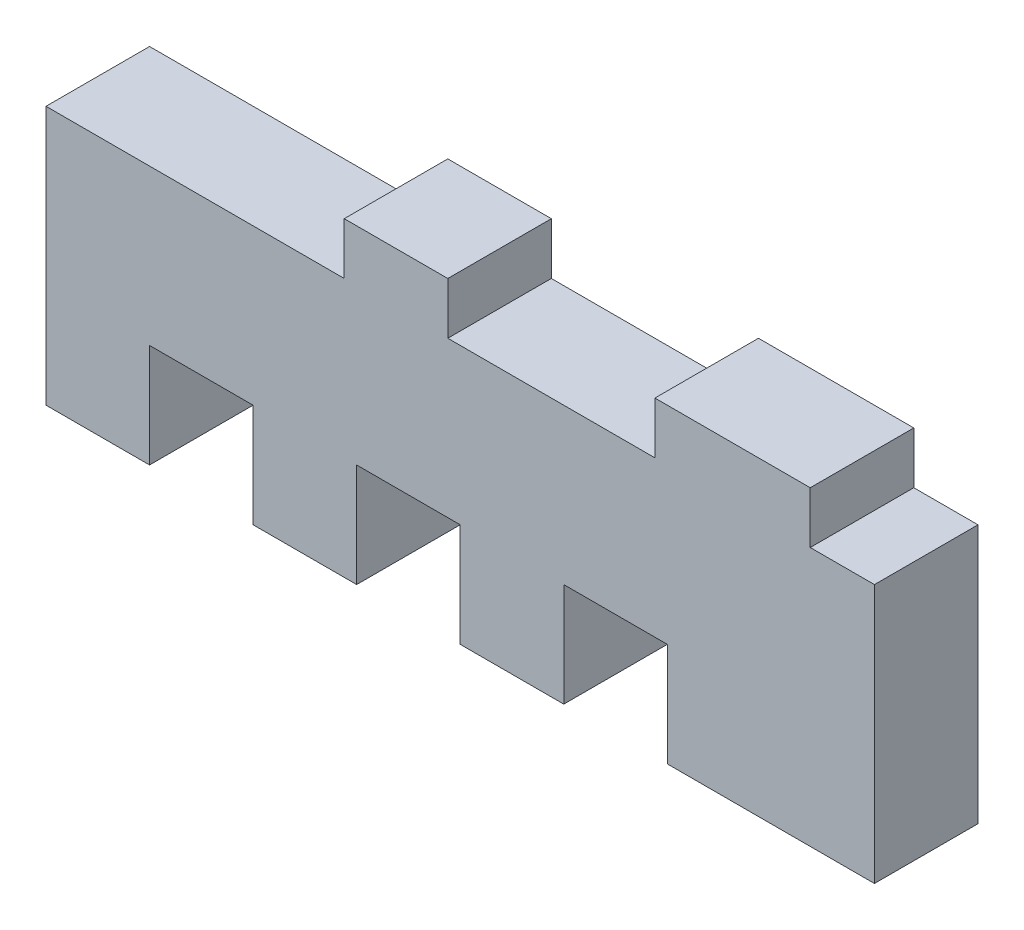
ISO-10303-21;
HEADER;
FILE_DESCRIPTION(('STEP AP214'),'2;1');
FILE_NAME('part.step','',(''),(''),'','','');
FILE_SCHEMA(('AUTOMOTIVE_DESIGN { 1 0 10303 214 1 1 1 1 }'));
ENDSEC;
DATA;
#1=APPLICATION_CONTEXT('core data for automotive mechanical design processes');
#2=APPLICATION_PROTOCOL_DEFINITION('international standard','automotive_design',2000,#1);
#3=PRODUCT_CONTEXT('',#1,'mechanical');
#4=PRODUCT('Part','Part','',(#3));
#5=PRODUCT_RELATED_PRODUCT_CATEGORY('part','',(#4));
#6=PRODUCT_DEFINITION_FORMATION('','',#4);
#7=PRODUCT_DEFINITION_CONTEXT('part definition',#1,'design');
#8=PRODUCT_DEFINITION('design','',#6,#7);
#9=PRODUCT_DEFINITION_SHAPE('','',#8);
#10=(LENGTH_UNIT() NAMED_UNIT(*) SI_UNIT(.MILLI.,.METRE.));
#11=(NAMED_UNIT(*) PLANE_ANGLE_UNIT() SI_UNIT($,.RADIAN.));
#12=(NAMED_UNIT(*) SI_UNIT($,.STERADIAN.) SOLID_ANGLE_UNIT());
#13=UNCERTAINTY_MEASURE_WITH_UNIT(LENGTH_MEASURE(1.E-05),#10,'distance_accuracy_value','');
#14=(GEOMETRIC_REPRESENTATION_CONTEXT(3) GLOBAL_UNCERTAINTY_ASSIGNED_CONTEXT((#13)) GLOBAL_UNIT_ASSIGNED_CONTEXT((#10,
#11,#12)) REPRESENTATION_CONTEXT('',''));
#15=CARTESIAN_POINT('',(0.,0.,0.));
#16=DIRECTION('',(0.,0.,1.));
#17=DIRECTION('',(1.,0.,0.));
#18=AXIS2_PLACEMENT_3D('',#15,#16,#17);
#19=CARTESIAN_POINT('',(0.,0.,12.7));
#20=DIRECTION('',(1.,0.,0.));
#21=DIRECTION('',(0.,1.,0.));
#22=AXIS2_PLACEMENT_3D('',#19,#20,#21);
#23=PLANE('',#22);
#24=DIRECTION('',(0.,-1.,0.));
#25=VECTOR('',#24,1.);
#26=CARTESIAN_POINT('',(0.,0.,0.));
#27=LINE('',#26,#25);
#28=CARTESIAN_POINT('',(0.,0.,0.));
#29=VERTEX_POINT('',#28);
#30=CARTESIAN_POINT('',(0.,-31.75,0.));
#31=VERTEX_POINT('',#30);
#32=EDGE_CURVE('E236',#29,#31,#27,.T.);
#33=ORIENTED_EDGE('',*,*,#32,.T.);
#34=DIRECTION('',(0.,0.,-1.));
#35=VECTOR('',#34,1.);
#36=CARTESIAN_POINT('',(0.,-31.75,12.7));
#37=LINE('',#36,#35);
#38=CARTESIAN_POINT('',(0.,-31.75,12.7));
#39=VERTEX_POINT('',#38);
#40=EDGE_CURVE('E11',#39,#31,#37,.T.);
#41=ORIENTED_EDGE('',*,*,#40,.F.);
#42=DIRECTION('',(0.,-1.,0.));
#43=VECTOR('',#42,1.);
#44=CARTESIAN_POINT('',(0.,0.,12.7));
#45=LINE('',#44,#43);
#46=CARTESIAN_POINT('',(0.,0.,12.7));
#47=VERTEX_POINT('',#46);
#48=EDGE_CURVE('E306',#47,#39,#45,.T.);
#49=ORIENTED_EDGE('',*,*,#48,.F.);
#50=DIRECTION('',(0.,0.,-1.));
#51=VECTOR('',#50,1.);
#52=CARTESIAN_POINT('',(0.,0.,12.7));
#53=LINE('',#52,#51);
#54=EDGE_CURVE('E232',#47,#29,#53,.T.);
#55=ORIENTED_EDGE('',*,*,#54,.T.);
#56=EDGE_LOOP('',(#33,#41,#49,#55));
#57=FACE_BOUND('',#56,.T.);
#58=ADVANCED_FACE('F39',(#57),#23,.F.);
#59=CARTESIAN_POINT('',(0.,-31.75,12.7));
#60=DIRECTION('',(0.,1.,0.));
#61=DIRECTION('',(0.,0.,1.));
#62=AXIS2_PLACEMENT_3D('',#59,#60,#61);
#63=PLANE('',#62);
#64=DIRECTION('',(1.,0.,0.));
#65=VECTOR('',#64,1.);
#66=CARTESIAN_POINT('',(0.,-31.75,0.));
#67=LINE('',#66,#65);
#68=CARTESIAN_POINT('',(12.7,-31.75,0.));
#69=VERTEX_POINT('',#68);
#70=EDGE_CURVE('E240',#31,#69,#67,.T.);
#71=ORIENTED_EDGE('',*,*,#70,.T.);
#72=DIRECTION('',(0.,0.,-1.));
#73=VECTOR('',#72,1.);
#74=CARTESIAN_POINT('',(12.7,-31.75,12.7));
#75=LINE('',#74,#73);
#76=CARTESIAN_POINT('',(12.7,-31.75,12.7));
#77=VERTEX_POINT('',#76);
#78=EDGE_CURVE('E48',#77,#69,#75,.T.);
#79=ORIENTED_EDGE('',*,*,#78,.F.);
#80=DIRECTION('',(1.,0.,0.));
#81=VECTOR('',#80,1.);
#82=CARTESIAN_POINT('',(0.,-31.75,12.7));
#83=LINE('',#82,#81);
#84=EDGE_CURVE('E147',#39,#77,#83,.T.);
#85=ORIENTED_EDGE('',*,*,#84,.F.);
#86=ORIENTED_EDGE('',*,*,#40,.T.);
#87=EDGE_LOOP('',(#71,#79,#85,#86));
#88=FACE_BOUND('',#87,.T.);
#89=ADVANCED_FACE('F484',(#88),#63,.F.);
#90=CARTESIAN_POINT('',(12.7,-31.75,12.7));
#91=DIRECTION('',(-1.,0.,0.));
#92=DIRECTION('',(0.,0.,1.));
#93=AXIS2_PLACEMENT_3D('',#90,#91,#92);
#94=PLANE('',#93);
#95=DIRECTION('',(0.,1.,0.));
#96=VECTOR('',#95,1.);
#97=CARTESIAN_POINT('',(12.7,-31.75,0.));
#98=LINE('',#97,#96);
#99=CARTESIAN_POINT('',(12.7,-19.05,0.));
#100=VERTEX_POINT('',#99);
#101=EDGE_CURVE('E243',#69,#100,#98,.T.);
#102=ORIENTED_EDGE('',*,*,#101,.T.);
#103=DIRECTION('',(0.,0.,-1.));
#104=VECTOR('',#103,1.);
#105=CARTESIAN_POINT('',(12.7,-19.05,12.7));
#106=LINE('',#105,#104);
#107=CARTESIAN_POINT('',(12.7,-19.05,12.7));
#108=VERTEX_POINT('',#107);
#109=EDGE_CURVE('E381',#108,#100,#106,.T.);
#110=ORIENTED_EDGE('',*,*,#109,.F.);
#111=DIRECTION('',(0.,1.,0.));
#112=VECTOR('',#111,1.);
#113=CARTESIAN_POINT('',(12.7,-31.75,12.7));
#114=LINE('',#113,#112);
#115=EDGE_CURVE('E391',#77,#108,#114,.T.);
#116=ORIENTED_EDGE('',*,*,#115,.F.);
#117=ORIENTED_EDGE('',*,*,#78,.T.);
#118=EDGE_LOOP('',(#102,#110,#116,#117));
#119=FACE_BOUND('',#118,.T.);
#120=ADVANCED_FACE('F389',(#119),#94,.F.);
#121=CARTESIAN_POINT('',(12.7,-19.05,12.7));
#122=DIRECTION('',(0.,1.,0.));
#123=DIRECTION('',(0.,0.,1.));
#124=AXIS2_PLACEMENT_3D('',#121,#122,#123);
#125=PLANE('',#124);
#126=DIRECTION('',(1.,0.,0.));
#127=VECTOR('',#126,1.);
#128=CARTESIAN_POINT('',(12.7,-19.05,0.));
#129=LINE('',#128,#127);
#130=CARTESIAN_POINT('',(25.4,-19.05,0.));
#131=VERTEX_POINT('',#130);
#132=EDGE_CURVE('E246',#100,#131,#129,.T.);
#133=ORIENTED_EDGE('',*,*,#132,.T.);
#134=DIRECTION('',(0.,0.,-1.));
#135=VECTOR('',#134,1.);
#136=CARTESIAN_POINT('',(25.4,-19.05,12.7));
#137=LINE('',#136,#135);
#138=CARTESIAN_POINT('',(25.4,-19.05,12.7));
#139=VERTEX_POINT('',#138);
#140=EDGE_CURVE('E377',#139,#131,#137,.T.);
#141=ORIENTED_EDGE('',*,*,#140,.F.);
#142=DIRECTION('',(1.,0.,0.));
#143=VECTOR('',#142,1.);
#144=CARTESIAN_POINT('',(12.7,-19.05,12.7));
#145=LINE('',#144,#143);
#146=EDGE_CURVE('E410',#108,#139,#145,.T.);
#147=ORIENTED_EDGE('',*,*,#146,.F.);
#148=ORIENTED_EDGE('',*,*,#109,.T.);
#149=EDGE_LOOP('',(#133,#141,#147,#148));
#150=FACE_BOUND('',#149,.T.);
#151=ADVANCED_FACE('F400',(#150),#125,.F.);
#152=CARTESIAN_POINT('',(25.4,-19.05,12.7));
#153=DIRECTION('',(1.,0.,0.));
#154=DIRECTION('',(0.,0.,-1.));
#155=AXIS2_PLACEMENT_3D('',#152,#153,#154);
#156=PLANE('',#155);
#157=DIRECTION('',(0.,-1.,0.));
#158=VECTOR('',#157,1.);
#159=CARTESIAN_POINT('',(25.4,-19.05,0.));
#160=LINE('',#159,#158);
#161=CARTESIAN_POINT('',(25.4,-31.75,0.));
#162=VERTEX_POINT('',#161);
#163=EDGE_CURVE('E249',#131,#162,#160,.T.);
#164=ORIENTED_EDGE('',*,*,#163,.T.);
#165=DIRECTION('',(0.,0.,-1.));
#166=VECTOR('',#165,1.);
#167=CARTESIAN_POINT('',(25.4,-31.75,12.7));
#168=LINE('',#167,#166);
#169=CARTESIAN_POINT('',(25.4,-31.75,12.7));
#170=VERTEX_POINT('',#169);
#171=EDGE_CURVE('E373',#170,#162,#168,.T.);
#172=ORIENTED_EDGE('',*,*,#171,.F.);
#173=DIRECTION('',(0.,-1.,0.));
#174=VECTOR('',#173,1.);
#175=CARTESIAN_POINT('',(25.4,-19.05,12.7));
#176=LINE('',#175,#174);
#177=EDGE_CURVE('E406',#139,#170,#176,.T.);
#178=ORIENTED_EDGE('',*,*,#177,.F.);
#179=ORIENTED_EDGE('',*,*,#140,.T.);
#180=EDGE_LOOP('',(#164,#172,#178,#179));
#181=FACE_BOUND('',#180,.T.);
#182=ADVANCED_FACE('F404',(#181),#156,.F.);
#183=CARTESIAN_POINT('',(25.4,-31.75,12.7));
#184=DIRECTION('',(0.,1.,0.));
#185=DIRECTION('',(0.,0.,1.));
#186=AXIS2_PLACEMENT_3D('',#183,#184,#185);
#187=PLANE('',#186);
#188=DIRECTION('',(1.,0.,0.));
#189=VECTOR('',#188,1.);
#190=CARTESIAN_POINT('',(25.4,-31.75,0.));
#191=LINE('',#190,#189);
#192=CARTESIAN_POINT('',(38.1,-31.75,0.));
#193=VERTEX_POINT('',#192);
#194=EDGE_CURVE('E252',#162,#193,#191,.T.);
#195=ORIENTED_EDGE('',*,*,#194,.T.);
#196=DIRECTION('',(0.,0.,-1.));
#197=VECTOR('',#196,1.);
#198=CARTESIAN_POINT('',(38.1,-31.75,12.7));
#199=LINE('',#198,#197);
#200=CARTESIAN_POINT('',(38.1,-31.75,12.7));
#201=VERTEX_POINT('',#200);
#202=EDGE_CURVE('E369',#201,#193,#199,.T.);
#203=ORIENTED_EDGE('',*,*,#202,.F.);
#204=DIRECTION('',(1.,0.,0.));
#205=VECTOR('',#204,1.);
#206=CARTESIAN_POINT('',(25.4,-31.75,12.7));
#207=LINE('',#206,#205);
#208=EDGE_CURVE('E409',#170,#201,#207,.T.);
#209=ORIENTED_EDGE('',*,*,#208,.F.);
#210=ORIENTED_EDGE('',*,*,#171,.T.);
#211=EDGE_LOOP('',(#195,#203,#209,#210));
#212=FACE_BOUND('',#211,.T.);
#213=ADVANCED_FACE('F497',(#212),#187,.F.);
#214=CARTESIAN_POINT('',(38.1,-31.75,12.7));
#215=DIRECTION('',(-1.,0.,0.));
#216=DIRECTION('',(0.,0.,1.));
#217=AXIS2_PLACEMENT_3D('',#214,#215,#216);
#218=PLANE('',#217);
#219=DIRECTION('',(0.,1.,0.));
#220=VECTOR('',#219,1.);
#221=CARTESIAN_POINT('',(38.1,-31.75,0.));
#222=LINE('',#221,#220);
#223=CARTESIAN_POINT('',(38.1,-19.05,0.));
#224=VERTEX_POINT('',#223);
#225=EDGE_CURVE('E255',#193,#224,#222,.T.);
#226=ORIENTED_EDGE('',*,*,#225,.T.);
#227=DIRECTION('',(0.,0.,-1.));
#228=VECTOR('',#227,1.);
#229=CARTESIAN_POINT('',(38.1,-19.05,12.7));
#230=LINE('',#229,#228);
#231=CARTESIAN_POINT('',(38.1,-19.05,12.7));
#232=VERTEX_POINT('',#231);
#233=EDGE_CURVE('E365',#232,#224,#230,.T.);
#234=ORIENTED_EDGE('',*,*,#233,.F.);
#235=DIRECTION('',(0.,1.,0.));
#236=VECTOR('',#235,1.);
#237=CARTESIAN_POINT('',(38.1,-31.75,12.7));
#238=LINE('',#237,#236);
#239=EDGE_CURVE('E414',#201,#232,#238,.T.);
#240=ORIENTED_EDGE('',*,*,#239,.F.);
#241=ORIENTED_EDGE('',*,*,#202,.T.);
#242=EDGE_LOOP('',(#226,#234,#240,#241));
#243=FACE_BOUND('',#242,.T.);
#244=ADVANCED_FACE('F500',(#243),#218,.F.);
#245=CARTESIAN_POINT('',(38.1,-19.05,12.7));
#246=DIRECTION('',(0.,1.,0.));
#247=DIRECTION('',(0.,0.,1.));
#248=AXIS2_PLACEMENT_3D('',#245,#246,#247);
#249=PLANE('',#248);
#250=DIRECTION('',(1.,0.,0.));
#251=VECTOR('',#250,1.);
#252=CARTESIAN_POINT('',(38.1,-19.05,0.));
#253=LINE('',#252,#251);
#254=CARTESIAN_POINT('',(50.8,-19.05,0.));
#255=VERTEX_POINT('',#254);
#256=EDGE_CURVE('E258',#224,#255,#253,.T.);
#257=ORIENTED_EDGE('',*,*,#256,.T.);
#258=DIRECTION('',(0.,0.,-1.));
#259=VECTOR('',#258,1.);
#260=CARTESIAN_POINT('',(50.8,-19.05,12.7));
#261=LINE('',#260,#259);
#262=CARTESIAN_POINT('',(50.8,-19.05,12.7));
#263=VERTEX_POINT('',#262);
#264=EDGE_CURVE('E361',#263,#255,#261,.T.);
#265=ORIENTED_EDGE('',*,*,#264,.F.);
#266=DIRECTION('',(1.,0.,0.));
#267=VECTOR('',#266,1.);
#268=CARTESIAN_POINT('',(38.1,-19.05,12.7));
#269=LINE('',#268,#267);
#270=EDGE_CURVE('E421',#232,#263,#269,.T.);
#271=ORIENTED_EDGE('',*,*,#270,.F.);
#272=ORIENTED_EDGE('',*,*,#233,.T.);
#273=EDGE_LOOP('',(#257,#265,#271,#272));
#274=FACE_BOUND('',#273,.T.);
#275=ADVANCED_FACE('F504',(#274),#249,.F.);
#276=CARTESIAN_POINT('',(50.8,-19.05,12.7));
#277=DIRECTION('',(1.,0.,0.));
#278=DIRECTION('',(0.,0.,-1.));
#279=AXIS2_PLACEMENT_3D('',#276,#277,#278);
#280=PLANE('',#279);
#281=DIRECTION('',(0.,-1.,0.));
#282=VECTOR('',#281,1.);
#283=CARTESIAN_POINT('',(50.8,-19.05,0.));
#284=LINE('',#283,#282);
#285=CARTESIAN_POINT('',(50.8,-31.75,0.));
#286=VERTEX_POINT('',#285);
#287=EDGE_CURVE('E261',#255,#286,#284,.T.);
#288=ORIENTED_EDGE('',*,*,#287,.T.);
#289=DIRECTION('',(0.,0.,-1.));
#290=VECTOR('',#289,1.);
#291=CARTESIAN_POINT('',(50.8,-31.75,12.7));
#292=LINE('',#291,#290);
#293=CARTESIAN_POINT('',(50.8,-31.75,12.7));
#294=VERTEX_POINT('',#293);
#295=EDGE_CURVE('E357',#294,#286,#292,.T.);
#296=ORIENTED_EDGE('',*,*,#295,.F.);
#297=DIRECTION('',(0.,-1.,0.));
#298=VECTOR('',#297,1.);
#299=CARTESIAN_POINT('',(50.8,-19.05,12.7));
#300=LINE('',#299,#298);
#301=EDGE_CURVE('E424',#263,#294,#300,.T.);
#302=ORIENTED_EDGE('',*,*,#301,.F.);
#303=ORIENTED_EDGE('',*,*,#264,.T.);
#304=EDGE_LOOP('',(#288,#296,#302,#303));
#305=FACE_BOUND('',#304,.T.);
#306=ADVANCED_FACE('F508',(#305),#280,.F.);
#307=CARTESIAN_POINT('',(50.8,-31.75,12.7));
#308=DIRECTION('',(0.,1.,0.));
#309=DIRECTION('',(0.,0.,1.));
#310=AXIS2_PLACEMENT_3D('',#307,#308,#309);
#311=PLANE('',#310);
#312=DIRECTION('',(1.,0.,0.));
#313=VECTOR('',#312,1.);
#314=CARTESIAN_POINT('',(50.8,-31.75,0.));
#315=LINE('',#314,#313);
#316=CARTESIAN_POINT('',(63.5,-31.75,0.));
#317=VERTEX_POINT('',#316);
#318=EDGE_CURVE('E264',#286,#317,#315,.T.);
#319=ORIENTED_EDGE('',*,*,#318,.T.);
#320=DIRECTION('',(0.,0.,-1.));
#321=VECTOR('',#320,1.);
#322=CARTESIAN_POINT('',(63.5,-31.75,12.7));
#323=LINE('',#322,#321);
#324=CARTESIAN_POINT('',(63.5,-31.75,12.7));
#325=VERTEX_POINT('',#324);
#326=EDGE_CURVE('E353',#325,#317,#323,.T.);
#327=ORIENTED_EDGE('',*,*,#326,.F.);
#328=DIRECTION('',(1.,0.,0.));
#329=VECTOR('',#328,1.);
#330=CARTESIAN_POINT('',(50.8,-31.75,12.7));
#331=LINE('',#330,#329);
#332=EDGE_CURVE('E427',#294,#325,#331,.T.);
#333=ORIENTED_EDGE('',*,*,#332,.F.);
#334=ORIENTED_EDGE('',*,*,#295,.T.);
#335=EDGE_LOOP('',(#319,#327,#333,#334));
#336=FACE_BOUND('',#335,.T.);
#337=ADVANCED_FACE('F512',(#336),#311,.F.);
#338=CARTESIAN_POINT('',(63.5,-31.75,12.7));
#339=DIRECTION('',(-1.,0.,0.));
#340=DIRECTION('',(0.,0.,1.));
#341=AXIS2_PLACEMENT_3D('',#338,#339,#340);
#342=PLANE('',#341);
#343=DIRECTION('',(0.,1.,0.));
#344=VECTOR('',#343,1.);
#345=CARTESIAN_POINT('',(63.5,-31.75,0.));
#346=LINE('',#345,#344);
#347=CARTESIAN_POINT('',(63.5,-19.05,0.));
#348=VERTEX_POINT('',#347);
#349=EDGE_CURVE('E267',#317,#348,#346,.T.);
#350=ORIENTED_EDGE('',*,*,#349,.T.);
#351=DIRECTION('',(0.,0.,-1.));
#352=VECTOR('',#351,1.);
#353=CARTESIAN_POINT('',(63.5,-19.05,12.7));
#354=LINE('',#353,#352);
#355=CARTESIAN_POINT('',(63.5,-19.05,12.7));
#356=VERTEX_POINT('',#355);
#357=EDGE_CURVE('E349',#356,#348,#354,.T.);
#358=ORIENTED_EDGE('',*,*,#357,.F.);
#359=DIRECTION('',(0.,1.,0.));
#360=VECTOR('',#359,1.);
#361=CARTESIAN_POINT('',(63.5,-31.75,12.7));
#362=LINE('',#361,#360);
#363=EDGE_CURVE('E430',#325,#356,#362,.T.);
#364=ORIENTED_EDGE('',*,*,#363,.F.);
#365=ORIENTED_EDGE('',*,*,#326,.T.);
#366=EDGE_LOOP('',(#350,#358,#364,#365));
#367=FACE_BOUND('',#366,.T.);
#368=ADVANCED_FACE('F516',(#367),#342,.F.);
#369=CARTESIAN_POINT('',(63.5,-19.05,12.7));
#370=DIRECTION('',(0.,1.,0.));
#371=DIRECTION('',(0.,0.,1.));
#372=AXIS2_PLACEMENT_3D('',#369,#370,#371);
#373=PLANE('',#372);
#374=DIRECTION('',(1.,0.,0.));
#375=VECTOR('',#374,1.);
#376=CARTESIAN_POINT('',(63.5,-19.05,0.));
#377=LINE('',#376,#375);
#378=CARTESIAN_POINT('',(76.2,-19.05,0.));
#379=VERTEX_POINT('',#378);
#380=EDGE_CURVE('E270',#348,#379,#377,.T.);
#381=ORIENTED_EDGE('',*,*,#380,.T.);
#382=DIRECTION('',(0.,0.,-1.));
#383=VECTOR('',#382,1.);
#384=CARTESIAN_POINT('',(76.2,-19.05,12.7));
#385=LINE('',#384,#383);
#386=CARTESIAN_POINT('',(76.2,-19.05,12.7));
#387=VERTEX_POINT('',#386);
#388=EDGE_CURVE('E345',#387,#379,#385,.T.);
#389=ORIENTED_EDGE('',*,*,#388,.F.);
#390=DIRECTION('',(1.,0.,0.));
#391=VECTOR('',#390,1.);
#392=CARTESIAN_POINT('',(63.5,-19.05,12.7));
#393=LINE('',#392,#391);
#394=EDGE_CURVE('E433',#356,#387,#393,.T.);
#395=ORIENTED_EDGE('',*,*,#394,.F.);
#396=ORIENTED_EDGE('',*,*,#357,.T.);
#397=EDGE_LOOP('',(#381,#389,#395,#396));
#398=FACE_BOUND('',#397,.T.);
#399=ADVANCED_FACE('F520',(#398),#373,.F.);
#400=CARTESIAN_POINT('',(76.2,-19.05,12.7));
#401=DIRECTION('',(1.,0.,0.));
#402=DIRECTION('',(0.,0.,-1.));
#403=AXIS2_PLACEMENT_3D('',#400,#401,#402);
#404=PLANE('',#403);
#405=DIRECTION('',(0.,-1.,0.));
#406=VECTOR('',#405,1.);
#407=CARTESIAN_POINT('',(76.2,-19.05,0.));
#408=LINE('',#407,#406);
#409=CARTESIAN_POINT('',(76.2,-31.75,0.));
#410=VERTEX_POINT('',#409);
#411=EDGE_CURVE('E273',#379,#410,#408,.T.);
#412=ORIENTED_EDGE('',*,*,#411,.T.);
#413=DIRECTION('',(0.,0.,-1.));
#414=VECTOR('',#413,1.);
#415=CARTESIAN_POINT('',(76.2,-31.75,12.7));
#416=LINE('',#415,#414);
#417=CARTESIAN_POINT('',(76.2,-31.75,12.7));
#418=VERTEX_POINT('',#417);
#419=EDGE_CURVE('E341',#418,#410,#416,.T.);
#420=ORIENTED_EDGE('',*,*,#419,.F.);
#421=DIRECTION('',(0.,-1.,0.));
#422=VECTOR('',#421,1.);
#423=CARTESIAN_POINT('',(76.2,-19.05,12.7));
#424=LINE('',#423,#422);
#425=EDGE_CURVE('E436',#387,#418,#424,.T.);
#426=ORIENTED_EDGE('',*,*,#425,.F.);
#427=ORIENTED_EDGE('',*,*,#388,.T.);
#428=EDGE_LOOP('',(#412,#420,#426,#427));
#429=FACE_BOUND('',#428,.T.);
#430=ADVANCED_FACE('F524',(#429),#404,.F.);
#431=CARTESIAN_POINT('',(76.2,-31.75,12.7));
#432=DIRECTION('',(0.,1.,0.));
#433=DIRECTION('',(0.,0.,1.));
#434=AXIS2_PLACEMENT_3D('',#431,#432,#433);
#435=PLANE('',#434);
#436=DIRECTION('',(1.,0.,0.));
#437=VECTOR('',#436,1.);
#438=CARTESIAN_POINT('',(76.2,-31.75,0.));
#439=LINE('',#438,#437);
#440=CARTESIAN_POINT('',(101.6,-31.75,0.));
#441=VERTEX_POINT('',#440);
#442=EDGE_CURVE('E276',#410,#441,#439,.T.);
#443=ORIENTED_EDGE('',*,*,#442,.T.);
#444=DIRECTION('',(0.,0.,-1.));
#445=VECTOR('',#444,1.);
#446=CARTESIAN_POINT('',(101.6,-31.75,12.7));
#447=LINE('',#446,#445);
#448=CARTESIAN_POINT('',(101.6,-31.75,12.7));
#449=VERTEX_POINT('',#448);
#450=EDGE_CURVE('E337',#449,#441,#447,.T.);
#451=ORIENTED_EDGE('',*,*,#450,.F.);
#452=DIRECTION('',(1.,0.,0.));
#453=VECTOR('',#452,1.);
#454=CARTESIAN_POINT('',(76.2,-31.75,12.7));
#455=LINE('',#454,#453);
#456=EDGE_CURVE('E439',#418,#449,#455,.T.);
#457=ORIENTED_EDGE('',*,*,#456,.F.);
#458=ORIENTED_EDGE('',*,*,#419,.T.);
#459=EDGE_LOOP('',(#443,#451,#457,#458));
#460=FACE_BOUND('',#459,.T.);
#461=ADVANCED_FACE('F528',(#460),#435,.F.);
#462=CARTESIAN_POINT('',(101.6,0.,12.7));
#463=DIRECTION('',(-1.,0.,0.));
#464=DIRECTION('',(0.,0.,1.));
#465=AXIS2_PLACEMENT_3D('',#462,#463,#464);
#466=PLANE('',#465);
#467=DIRECTION('',(0.,1.,0.));
#468=VECTOR('',#467,1.);
#469=CARTESIAN_POINT('',(101.6,0.,0.));
#470=LINE('',#469,#468);
#471=CARTESIAN_POINT('',(101.6,0.,0.));
#472=VERTEX_POINT('',#471);
#473=EDGE_CURVE('E279',#441,#472,#470,.T.);
#474=ORIENTED_EDGE('',*,*,#473,.T.);
#475=DIRECTION('',(0.,0.,-1.));
#476=VECTOR('',#475,1.);
#477=CARTESIAN_POINT('',(101.6,0.,12.7));
#478=LINE('',#477,#476);
#479=CARTESIAN_POINT('',(101.6,0.,12.7));
#480=VERTEX_POINT('',#479);
#481=EDGE_CURVE('E333',#480,#472,#478,.T.);
#482=ORIENTED_EDGE('',*,*,#481,.F.);
#483=DIRECTION('',(0.,1.,0.));
#484=VECTOR('',#483,1.);
#485=CARTESIAN_POINT('',(101.6,0.,12.7));
#486=LINE('',#485,#484);
#487=EDGE_CURVE('E442',#449,#480,#486,.T.);
#488=ORIENTED_EDGE('',*,*,#487,.F.);
#489=ORIENTED_EDGE('',*,*,#450,.T.);
#490=EDGE_LOOP('',(#474,#482,#488,#489));
#491=FACE_BOUND('',#490,.T.);
#492=ADVANCED_FACE('F532',(#491),#466,.F.);
#493=CARTESIAN_POINT('',(93.726,0.,12.7));
#494=DIRECTION('',(0.,-1.,0.));
#495=DIRECTION('',(0.,0.,-1.));
#496=AXIS2_PLACEMENT_3D('',#493,#494,#495);
#497=PLANE('',#496);
#498=DIRECTION('',(-1.,0.,0.));
#499=VECTOR('',#498,1.);
#500=CARTESIAN_POINT('',(93.726,0.,0.));
#501=LINE('',#500,#499);
#502=CARTESIAN_POINT('',(93.726,0.,0.));
#503=VERTEX_POINT('',#502);
#504=EDGE_CURVE('E282',#472,#503,#501,.T.);
#505=ORIENTED_EDGE('',*,*,#504,.T.);
#506=DIRECTION('',(0.,0.,-1.));
#507=VECTOR('',#506,1.);
#508=CARTESIAN_POINT('',(93.726,0.,12.7));
#509=LINE('',#508,#507);
#510=CARTESIAN_POINT('',(93.726,0.,12.7));
#511=VERTEX_POINT('',#510);
#512=EDGE_CURVE('E329',#511,#503,#509,.T.);
#513=ORIENTED_EDGE('',*,*,#512,.F.);
#514=DIRECTION('',(-1.,0.,0.));
#515=VECTOR('',#514,1.);
#516=CARTESIAN_POINT('',(93.726,0.,12.7));
#517=LINE('',#516,#515);
#518=EDGE_CURVE('E445',#480,#511,#517,.T.);
#519=ORIENTED_EDGE('',*,*,#518,.F.);
#520=ORIENTED_EDGE('',*,*,#481,.T.);
#521=EDGE_LOOP('',(#505,#513,#519,#520));
#522=FACE_BOUND('',#521,.T.);
#523=ADVANCED_FACE('F536',(#522),#497,.F.);
#524=CARTESIAN_POINT('',(93.726,6.35,12.7));
#525=DIRECTION('',(-1.,0.,0.));
#526=DIRECTION('',(0.,0.,1.));
#527=AXIS2_PLACEMENT_3D('',#524,#525,#526);
#528=PLANE('',#527);
#529=DIRECTION('',(0.,1.,0.));
#530=VECTOR('',#529,1.);
#531=CARTESIAN_POINT('',(93.726,6.35,0.));
#532=LINE('',#531,#530);
#533=CARTESIAN_POINT('',(93.726,6.35,0.));
#534=VERTEX_POINT('',#533);
#535=EDGE_CURVE('E285',#503,#534,#532,.T.);
#536=ORIENTED_EDGE('',*,*,#535,.T.);
#537=DIRECTION('',(0.,0.,-1.));
#538=VECTOR('',#537,1.);
#539=CARTESIAN_POINT('',(93.726,6.35,12.7));
#540=LINE('',#539,#538);
#541=CARTESIAN_POINT('',(93.726,6.35,12.7));
#542=VERTEX_POINT('',#541);
#543=EDGE_CURVE('E325',#542,#534,#540,.T.);
#544=ORIENTED_EDGE('',*,*,#543,.F.);
#545=DIRECTION('',(0.,1.,0.));
#546=VECTOR('',#545,1.);
#547=CARTESIAN_POINT('',(93.726,6.35,12.7));
#548=LINE('',#547,#546);
#549=EDGE_CURVE('E448',#511,#542,#548,.T.);
#550=ORIENTED_EDGE('',*,*,#549,.F.);
#551=ORIENTED_EDGE('',*,*,#512,.T.);
#552=EDGE_LOOP('',(#536,#544,#550,#551));
#553=FACE_BOUND('',#552,.T.);
#554=ADVANCED_FACE('F540',(#553),#528,.F.);
#555=CARTESIAN_POINT('',(74.676,6.35,12.7));
#556=DIRECTION('',(0.,-1.,0.));
#557=DIRECTION('',(0.,0.,-1.));
#558=AXIS2_PLACEMENT_3D('',#555,#556,#557);
#559=PLANE('',#558);
#560=DIRECTION('',(-1.,0.,0.));
#561=VECTOR('',#560,1.);
#562=CARTESIAN_POINT('',(74.676,6.35,0.));
#563=LINE('',#562,#561);
#564=CARTESIAN_POINT('',(74.676,6.35,0.));
#565=VERTEX_POINT('',#564);
#566=EDGE_CURVE('E288',#534,#565,#563,.T.);
#567=ORIENTED_EDGE('',*,*,#566,.T.);
#568=DIRECTION('',(0.,0.,-1.));
#569=VECTOR('',#568,1.);
#570=CARTESIAN_POINT('',(74.676,6.35,12.7));
#571=LINE('',#570,#569);
#572=CARTESIAN_POINT('',(74.676,6.35,12.7));
#573=VERTEX_POINT('',#572);
#574=EDGE_CURVE('E321',#573,#565,#571,.T.);
#575=ORIENTED_EDGE('',*,*,#574,.F.);
#576=DIRECTION('',(-1.,0.,0.));
#577=VECTOR('',#576,1.);
#578=CARTESIAN_POINT('',(74.676,6.35,12.7));
#579=LINE('',#578,#577);
#580=EDGE_CURVE('E451',#542,#573,#579,.T.);
#581=ORIENTED_EDGE('',*,*,#580,.F.);
#582=ORIENTED_EDGE('',*,*,#543,.T.);
#583=EDGE_LOOP('',(#567,#575,#581,#582));
#584=FACE_BOUND('',#583,.T.);
#585=ADVANCED_FACE('F544',(#584),#559,.F.);
#586=CARTESIAN_POINT('',(74.676,0.,12.7));
#587=DIRECTION('',(1.,0.,0.));
#588=DIRECTION('',(0.,0.,-1.));
#589=AXIS2_PLACEMENT_3D('',#586,#587,#588);
#590=PLANE('',#589);
#591=DIRECTION('',(0.,-1.,0.));
#592=VECTOR('',#591,1.);
#593=CARTESIAN_POINT('',(74.676,0.,0.));
#594=LINE('',#593,#592);
#595=CARTESIAN_POINT('',(74.676,0.,0.));
#596=VERTEX_POINT('',#595);
#597=EDGE_CURVE('E291',#565,#596,#594,.T.);
#598=ORIENTED_EDGE('',*,*,#597,.T.);
#599=DIRECTION('',(0.,0.,-1.));
#600=VECTOR('',#599,1.);
#601=CARTESIAN_POINT('',(74.676,0.,12.7));
#602=LINE('',#601,#600);
#603=CARTESIAN_POINT('',(74.676,0.,12.7));
#604=VERTEX_POINT('',#603);
#605=EDGE_CURVE('E317',#604,#596,#602,.T.);
#606=ORIENTED_EDGE('',*,*,#605,.F.);
#607=DIRECTION('',(0.,-1.,0.));
#608=VECTOR('',#607,1.);
#609=CARTESIAN_POINT('',(74.676,0.,12.7));
#610=LINE('',#609,#608);
#611=EDGE_CURVE('E454',#573,#604,#610,.T.);
#612=ORIENTED_EDGE('',*,*,#611,.F.);
#613=ORIENTED_EDGE('',*,*,#574,.T.);
#614=EDGE_LOOP('',(#598,#606,#612,#613));
#615=FACE_BOUND('',#614,.T.);
#616=ADVANCED_FACE('F548',(#615),#590,.F.);
#617=CARTESIAN_POINT('',(49.276,0.,12.7));
#618=DIRECTION('',(0.,-1.,0.));
#619=DIRECTION('',(0.,0.,-1.));
#620=AXIS2_PLACEMENT_3D('',#617,#618,#619);
#621=PLANE('',#620);
#622=DIRECTION('',(-1.,0.,0.));
#623=VECTOR('',#622,1.);
#624=CARTESIAN_POINT('',(49.276,0.,0.));
#625=LINE('',#624,#623);
#626=CARTESIAN_POINT('',(49.276,0.,0.));
#627=VERTEX_POINT('',#626);
#628=EDGE_CURVE('E294',#596,#627,#625,.T.);
#629=ORIENTED_EDGE('',*,*,#628,.T.);
#630=DIRECTION('',(0.,0.,-1.));
#631=VECTOR('',#630,1.);
#632=CARTESIAN_POINT('',(49.276,0.,12.7));
#633=LINE('',#632,#631);
#634=CARTESIAN_POINT('',(49.276,0.,12.7));
#635=VERTEX_POINT('',#634);
#636=EDGE_CURVE('E313',#635,#627,#633,.T.);
#637=ORIENTED_EDGE('',*,*,#636,.F.);
#638=DIRECTION('',(-1.,0.,0.));
#639=VECTOR('',#638,1.);
#640=CARTESIAN_POINT('',(49.276,0.,12.7));
#641=LINE('',#640,#639);
#642=EDGE_CURVE('E457',#604,#635,#641,.T.);
#643=ORIENTED_EDGE('',*,*,#642,.F.);
#644=ORIENTED_EDGE('',*,*,#605,.T.);
#645=EDGE_LOOP('',(#629,#637,#643,#644));
#646=FACE_BOUND('',#645,.T.);
#647=ADVANCED_FACE('F465',(#646),#621,.F.);
#648=CARTESIAN_POINT('',(49.276,6.35,12.7));
#649=DIRECTION('',(-1.,0.,0.));
#650=DIRECTION('',(0.,0.,1.));
#651=AXIS2_PLACEMENT_3D('',#648,#649,#650);
#652=PLANE('',#651);
#653=DIRECTION('',(0.,1.,0.));
#654=VECTOR('',#653,1.);
#655=CARTESIAN_POINT('',(49.276,6.35,0.));
#656=LINE('',#655,#654);
#657=CARTESIAN_POINT('',(49.276,6.35,0.));
#658=VERTEX_POINT('',#657);
#659=EDGE_CURVE('E297',#627,#658,#656,.T.);
#660=ORIENTED_EDGE('',*,*,#659,.T.);
#661=DIRECTION('',(0.,0.,-1.));
#662=VECTOR('',#661,1.);
#663=CARTESIAN_POINT('',(49.276,6.35,12.7));
#664=LINE('',#663,#662);
#665=CARTESIAN_POINT('',(49.276,6.35,12.7));
#666=VERTEX_POINT('',#665);
#667=EDGE_CURVE('E225',#666,#658,#664,.T.);
#668=ORIENTED_EDGE('',*,*,#667,.F.);
#669=DIRECTION('',(0.,1.,0.));
#670=VECTOR('',#669,1.);
#671=CARTESIAN_POINT('',(49.276,6.35,12.7));
#672=LINE('',#671,#670);
#673=EDGE_CURVE('E214',#635,#666,#672,.T.);
#674=ORIENTED_EDGE('',*,*,#673,.F.);
#675=ORIENTED_EDGE('',*,*,#636,.T.);
#676=EDGE_LOOP('',(#660,#668,#674,#675));
#677=FACE_BOUND('',#676,.T.);
#678=ADVANCED_FACE('F469',(#677),#652,.F.);
#679=CARTESIAN_POINT('',(36.576,6.35,12.7));
#680=DIRECTION('',(0.,-1.,0.));
#681=DIRECTION('',(0.,0.,-1.));
#682=AXIS2_PLACEMENT_3D('',#679,#680,#681);
#683=PLANE('',#682);
#684=DIRECTION('',(-1.,0.,0.));
#685=VECTOR('',#684,1.);
#686=CARTESIAN_POINT('',(36.576,6.35,0.));
#687=LINE('',#686,#685);
#688=CARTESIAN_POINT('',(36.576,6.35,0.));
#689=VERTEX_POINT('',#688);
#690=EDGE_CURVE('E223',#658,#689,#687,.T.);
#691=ORIENTED_EDGE('',*,*,#690,.T.);
#692=DIRECTION('',(0.,0.,-1.));
#693=VECTOR('',#692,1.);
#694=CARTESIAN_POINT('',(36.576,6.35,12.7));
#695=LINE('',#694,#693);
#696=CARTESIAN_POINT('',(36.576,6.35,12.7));
#697=VERTEX_POINT('',#696);
#698=EDGE_CURVE('E220',#697,#689,#695,.T.);
#699=ORIENTED_EDGE('',*,*,#698,.F.);
#700=DIRECTION('',(-1.,0.,0.));
#701=VECTOR('',#700,1.);
#702=CARTESIAN_POINT('',(36.576,6.35,12.7));
#703=LINE('',#702,#701);
#704=EDGE_CURVE('E208',#666,#697,#703,.T.);
#705=ORIENTED_EDGE('',*,*,#704,.F.);
#706=ORIENTED_EDGE('',*,*,#667,.T.);
#707=EDGE_LOOP('',(#691,#699,#705,#706));
#708=FACE_BOUND('',#707,.T.);
#709=ADVANCED_FACE('F221',(#708),#683,.F.);
#710=CARTESIAN_POINT('',(36.576,0.,12.7));
#711=DIRECTION('',(1.,0.,0.));
#712=DIRECTION('',(0.,0.,-1.));
#713=AXIS2_PLACEMENT_3D('',#710,#711,#712);
#714=PLANE('',#713);
#715=DIRECTION('',(0.,-1.,0.));
#716=VECTOR('',#715,1.);
#717=CARTESIAN_POINT('',(36.576,0.,0.));
#718=LINE('',#717,#716);
#719=CARTESIAN_POINT('',(36.576,0.,0.));
#720=VERTEX_POINT('',#719);
#721=EDGE_CURVE('E133',#689,#720,#718,.T.);
#722=ORIENTED_EDGE('',*,*,#721,.T.);
#723=DIRECTION('',(0.,0.,-1.));
#724=VECTOR('',#723,1.);
#725=CARTESIAN_POINT('',(36.576,0.,12.7));
#726=LINE('',#725,#724);
#727=CARTESIAN_POINT('',(36.576,0.,12.7));
#728=VERTEX_POINT('',#727);
#729=EDGE_CURVE('E226',#728,#720,#726,.T.);
#730=ORIENTED_EDGE('',*,*,#729,.F.);
#731=DIRECTION('',(0.,-1.,0.));
#732=VECTOR('',#731,1.);
#733=CARTESIAN_POINT('',(36.576,0.,12.7));
#734=LINE('',#733,#732);
#735=EDGE_CURVE('E212',#697,#728,#734,.T.);
#736=ORIENTED_EDGE('',*,*,#735,.F.);
#737=ORIENTED_EDGE('',*,*,#698,.T.);
#738=EDGE_LOOP('',(#722,#730,#736,#737));
#739=FACE_BOUND('',#738,.T.);
#740=ADVANCED_FACE('F228',(#739),#714,.F.);
#741=CARTESIAN_POINT('',(0.,0.,12.7));
#742=DIRECTION('',(0.,-1.,0.));
#743=DIRECTION('',(0.,0.,-1.));
#744=AXIS2_PLACEMENT_3D('',#741,#742,#743);
#745=PLANE('',#744);
#746=DIRECTION('',(-1.,0.,0.));
#747=VECTOR('',#746,1.);
#748=CARTESIAN_POINT('',(0.,0.,0.));
#749=LINE('',#748,#747);
#750=EDGE_CURVE('E139',#720,#29,#749,.T.);
#751=ORIENTED_EDGE('',*,*,#750,.T.);
#752=ORIENTED_EDGE('',*,*,#54,.F.);
#753=DIRECTION('',(-1.,0.,0.));
#754=VECTOR('',#753,1.);
#755=CARTESIAN_POINT('',(0.,0.,12.7));
#756=LINE('',#755,#754);
#757=EDGE_CURVE('E56',#728,#47,#756,.T.);
#758=ORIENTED_EDGE('',*,*,#757,.F.);
#759=ORIENTED_EDGE('',*,*,#729,.T.);
#760=EDGE_LOOP('',(#751,#752,#758,#759));
#761=FACE_BOUND('',#760,.T.);
#762=ADVANCED_FACE('F473',(#761),#745,.F.);
#763=CARTESIAN_POINT('',(0.,0.,12.7));
#764=DIRECTION('',(0.,0.,1.));
#765=DIRECTION('',(1.,0.,0.));
#766=AXIS2_PLACEMENT_3D('',#763,#764,#765);
#767=PLANE('',#766);
#768=ORIENTED_EDGE('',*,*,#48,.T.);
#769=ORIENTED_EDGE('',*,*,#84,.T.);
#770=ORIENTED_EDGE('',*,*,#115,.T.);
#771=ORIENTED_EDGE('',*,*,#146,.T.);
#772=ORIENTED_EDGE('',*,*,#177,.T.);
#773=ORIENTED_EDGE('',*,*,#208,.T.);
#774=ORIENTED_EDGE('',*,*,#239,.T.);
#775=ORIENTED_EDGE('',*,*,#270,.T.);
#776=ORIENTED_EDGE('',*,*,#301,.T.);
#777=ORIENTED_EDGE('',*,*,#332,.T.);
#778=ORIENTED_EDGE('',*,*,#363,.T.);
#779=ORIENTED_EDGE('',*,*,#394,.T.);
#780=ORIENTED_EDGE('',*,*,#425,.T.);
#781=ORIENTED_EDGE('',*,*,#456,.T.);
#782=ORIENTED_EDGE('',*,*,#487,.T.);
#783=ORIENTED_EDGE('',*,*,#518,.T.);
#784=ORIENTED_EDGE('',*,*,#549,.T.);
#785=ORIENTED_EDGE('',*,*,#580,.T.);
#786=ORIENTED_EDGE('',*,*,#611,.T.);
#787=ORIENTED_EDGE('',*,*,#642,.T.);
#788=ORIENTED_EDGE('',*,*,#673,.T.);
#789=ORIENTED_EDGE('',*,*,#704,.T.);
#790=ORIENTED_EDGE('',*,*,#735,.T.);
#791=ORIENTED_EDGE('',*,*,#757,.T.);
#792=EDGE_LOOP('',(#768,#769,#770,#771,#772,#773,#774,#775,#776,#777,#778,#779,#780,#781,#782,
#783,#784,#785,#786,#787,#788,#789,#790,#791));
#793=FACE_BOUND('',#792,.T.);
#794=ADVANCED_FACE('F210',(#793),#767,.T.);
#795=CARTESIAN_POINT('',(0.,0.,0.));
#796=DIRECTION('',(0.,0.,1.));
#797=DIRECTION('',(1.,0.,0.));
#798=AXIS2_PLACEMENT_3D('',#795,#796,#797);
#799=PLANE('',#798);
#800=ORIENTED_EDGE('',*,*,#32,.F.);
#801=ORIENTED_EDGE('',*,*,#750,.F.);
#802=ORIENTED_EDGE('',*,*,#721,.F.);
#803=ORIENTED_EDGE('',*,*,#690,.F.);
#804=ORIENTED_EDGE('',*,*,#659,.F.);
#805=ORIENTED_EDGE('',*,*,#628,.F.);
#806=ORIENTED_EDGE('',*,*,#597,.F.);
#807=ORIENTED_EDGE('',*,*,#566,.F.);
#808=ORIENTED_EDGE('',*,*,#535,.F.);
#809=ORIENTED_EDGE('',*,*,#504,.F.);
#810=ORIENTED_EDGE('',*,*,#473,.F.);
#811=ORIENTED_EDGE('',*,*,#442,.F.);
#812=ORIENTED_EDGE('',*,*,#411,.F.);
#813=ORIENTED_EDGE('',*,*,#380,.F.);
#814=ORIENTED_EDGE('',*,*,#349,.F.);
#815=ORIENTED_EDGE('',*,*,#318,.F.);
#816=ORIENTED_EDGE('',*,*,#287,.F.);
#817=ORIENTED_EDGE('',*,*,#256,.F.);
#818=ORIENTED_EDGE('',*,*,#225,.F.);
#819=ORIENTED_EDGE('',*,*,#194,.F.);
#820=ORIENTED_EDGE('',*,*,#163,.F.);
#821=ORIENTED_EDGE('',*,*,#132,.F.);
#822=ORIENTED_EDGE('',*,*,#101,.F.);
#823=ORIENTED_EDGE('',*,*,#70,.F.);
#824=EDGE_LOOP('',(#800,#801,#802,#803,#804,#805,#806,#807,#808,#809,#810,#811,#812,#813,#814,
#815,#816,#817,#818,#819,#820,#821,#822,#823));
#825=FACE_BOUND('',#824,.T.);
#826=ADVANCED_FACE('F395',(#825),#799,.F.);
#827=CLOSED_SHELL('',(#58,#89,#120,#151,#182,#213,#244,#275,#306,#337,#368,#399,#430,#461,#492,
#523,#554,#585,#616,#647,#678,#709,#740,#762,#794,#826));
#828=MANIFOLD_SOLID_BREP('B2',#827);
#829=ADVANCED_BREP_SHAPE_REPRESENTATION('',(#18,#828),#14);
#830=SHAPE_DEFINITION_REPRESENTATION(#9,#829);
ENDSEC;
END-ISO-10303-21;
